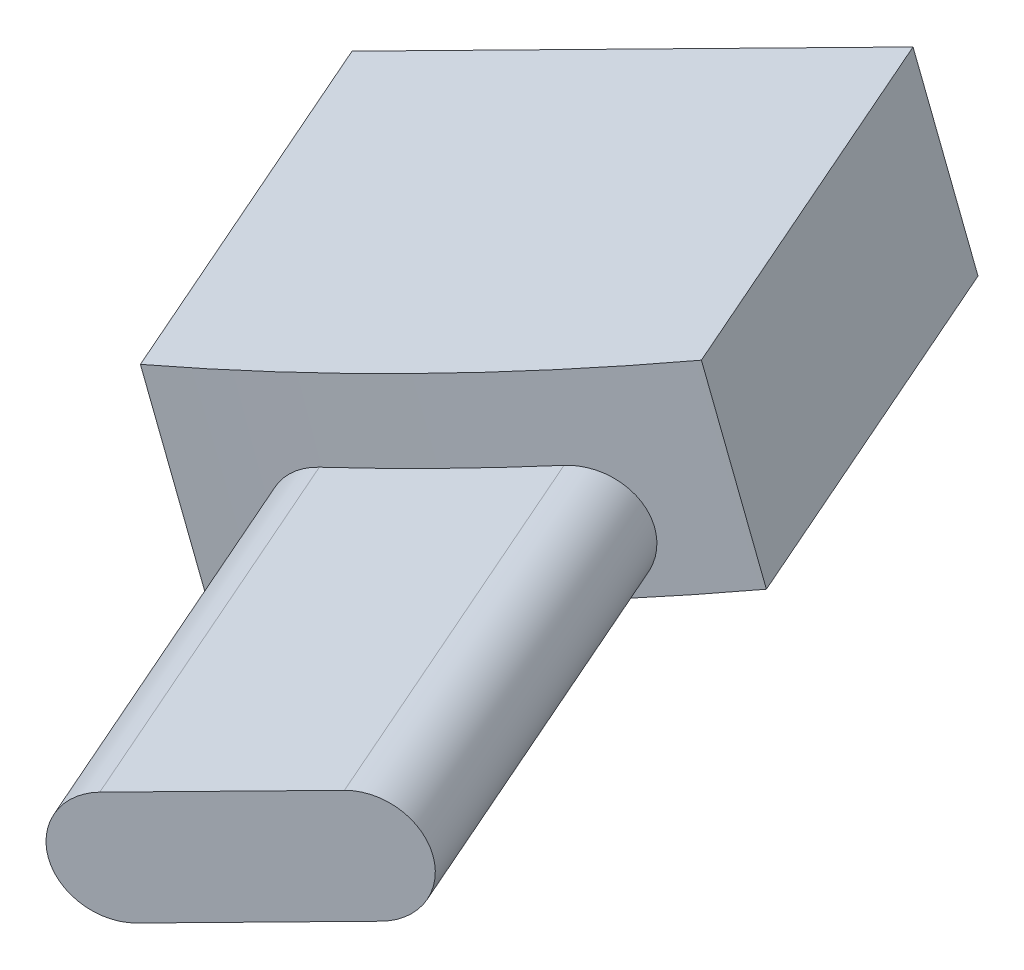
ISO-10303-21;
HEADER;
FILE_DESCRIPTION(('STEP AP214'),'2;1');
FILE_NAME('part.step','',(''),(''),'','','');
FILE_SCHEMA(('AUTOMOTIVE_DESIGN { 1 0 10303 214 1 1 1 1 }'));
ENDSEC;
DATA;
#1=APPLICATION_CONTEXT('core data for automotive mechanical design processes');
#2=APPLICATION_PROTOCOL_DEFINITION('international standard','automotive_design',2000,#1);
#3=PRODUCT_CONTEXT('',#1,'mechanical');
#4=PRODUCT('Part','Part','',(#3));
#5=PRODUCT_RELATED_PRODUCT_CATEGORY('part','',(#4));
#6=PRODUCT_DEFINITION_FORMATION('','',#4);
#7=PRODUCT_DEFINITION_CONTEXT('part definition',#1,'design');
#8=PRODUCT_DEFINITION('design','',#6,#7);
#9=PRODUCT_DEFINITION_SHAPE('','',#8);
#10=(LENGTH_UNIT() NAMED_UNIT(*) SI_UNIT(.MILLI.,.METRE.));
#11=(NAMED_UNIT(*) PLANE_ANGLE_UNIT() SI_UNIT($,.RADIAN.));
#12=(NAMED_UNIT(*) SI_UNIT($,.STERADIAN.) SOLID_ANGLE_UNIT());
#13=UNCERTAINTY_MEASURE_WITH_UNIT(LENGTH_MEASURE(1.E-05),#10,'distance_accuracy_value','');
#14=(GEOMETRIC_REPRESENTATION_CONTEXT(3) GLOBAL_UNCERTAINTY_ASSIGNED_CONTEXT((#13)) GLOBAL_UNIT_ASSIGNED_CONTEXT((#10,
#11,#12)) REPRESENTATION_CONTEXT('',''));
#15=CARTESIAN_POINT('',(0.,0.,0.));
#16=DIRECTION('',(0.,0.,1.));
#17=DIRECTION('',(1.,0.,0.));
#18=AXIS2_PLACEMENT_3D('',#15,#16,#17);
#19=CARTESIAN_POINT('',(9.646987504511,19.1307658125472,88.7231192482595));
#20=DIRECTION('',(0.885067626485375,0.256638244346747,-0.388319595289969));
#21=DIRECTION('',(-0.401776066912331,0.,-0.915737949446488));
#22=AXIS2_PLACEMENT_3D('',#19,#20,#21);
#23=PLANE('',#22);
#24=DIRECTION('',(-0.401776066812214,-4.11737773505413E-10,-0.915737949490414));
#25=VECTOR('',#24,1.);
#26=CARTESIAN_POINT('',(8.00189384591943,25.8963185442456,89.4448969765592));
#27=LINE('',#26,#25);
#28=CARTESIAN_POINT('',(8.00189384591942,25.8963185442456,89.4448969765592));
#29=VERTEX_POINT('',#28);
#30=CARTESIAN_POINT('',(1.97525284373622,25.8963185380696,75.708827734203));
#31=VERTEX_POINT('',#30);
#32=EDGE_CURVE('E187',#29,#31,#27,.T.);
#33=ORIENTED_EDGE('',*,*,#32,.F.);
#34=DIRECTION('',(-0.235013379798795,0.966507533099779,0.103111104042812));
#35=VECTOR('',#34,1.);
#36=CARTESIAN_POINT('',(9.64698750451099,19.1307658125472,88.7231192482595));
#37=LINE('',#36,#35);
#38=CARTESIAN_POINT('',(9.64698750451099,19.1307658125472,88.7231192482595));
#39=VERTEX_POINT('',#38);
#40=EDGE_CURVE('E11',#39,#29,#37,.T.);
#41=ORIENTED_EDGE('',*,*,#40,.F.);
#42=DIRECTION('',(-0.401776066812214,-4.11737773505413E-10,-0.915737949490414));
#43=VECTOR('',#42,1.);
#44=CARTESIAN_POINT('',(9.646987504511,19.1307658125472,88.7231192482595));
#45=LINE('',#44,#43);
#46=CARTESIAN_POINT('',(3.62034650232779,19.1307658063711,74.9870500059033));
#47=VERTEX_POINT('',#46);
#48=EDGE_CURVE('E188',#39,#47,#45,.T.);
#49=ORIENTED_EDGE('',*,*,#48,.T.);
#50=DIRECTION('',(-0.235013379798795,0.966507533099779,0.103111104042812));
#51=VECTOR('',#50,1.);
#52=CARTESIAN_POINT('',(3.62034650232779,19.1307658063711,74.9870500059033));
#53=LINE('',#52,#51);
#54=EDGE_CURVE('E48',#47,#31,#53,.T.);
#55=ORIENTED_EDGE('',*,*,#54,.T.);
#56=EDGE_LOOP('',(#33,#41,#49,#55));
#57=FACE_BOUND('',#56,.T.);
#58=ADVANCED_FACE('F45',(#57),#23,.T.);
#59=CARTESIAN_POINT('',(-21.3456492501435,17.0712438771823,37.3887756136927));
#60=DIRECTION('',(-0.235013379798795,0.966507533099779,0.103111104042812));
#61=DIRECTION('',(-0.971686774379493,-0.236272750218843,0.));
#62=AXIS2_PLACEMENT_3D('',#59,#60,#61);
#63=CYLINDRICAL_SURFACE('',#62,60.);
#64=CARTESIAN_POINT('',(5.79410052273842,18.0661285103681,90.8906838678102));
#65=CARTESIAN_POINT('',(5.84268757366697,18.0806012898717,90.8657686390721));
#66=CARTESIAN_POINT('',(5.89065395389025,18.0973716985718,90.8410394112202));
#67=CARTESIAN_POINT('',(5.98505235872396,18.1353923376617,90.7921090073356));
#68=CARTESIAN_POINT('',(6.0314844669757,18.1566423233784,90.7679078025421));
#69=CARTESIAN_POINT('',(6.16790246919323,18.2268664585587,90.6964023814954));
#70=CARTESIAN_POINT('',(6.25516698683082,18.2823617400123,90.6501158390123));
#71=CARTESIAN_POINT('',(6.41979842936133,18.4091176746111,90.5617402389683));
#72=CARTESIAN_POINT('',(6.49716106200161,18.4803851283662,90.519653003447));
#73=CARTESIAN_POINT('',(6.63985324153835,18.6366660540754,90.4409756925246));
#74=CARTESIAN_POINT('',(6.70518499498658,18.72167699999,90.4043846093161));
#75=CARTESIAN_POINT('',(6.82203777539817,18.9030787182387,90.3378652897426));
#76=CARTESIAN_POINT('',(6.87355456904182,18.9994729657555,90.3079390961756));
#77=CARTESIAN_POINT('',(6.96134791850842,19.2009130587532,90.2557644567414));
#78=CARTESIAN_POINT('',(6.99762237734172,19.3059600922795,90.2335170673736));
#79=CARTESIAN_POINT('',(7.05386417878532,19.5214755598854,90.1975349450172));
#80=CARTESIAN_POINT('',(7.07386670972647,19.6319317448042,90.1837818585512));
#81=CARTESIAN_POINT('',(7.09715382237713,19.8553239238719,90.1652388584531));
#82=CARTESIAN_POINT('',(7.10043982619539,19.9682597062555,90.1604481823926));
#83=CARTESIAN_POINT('',(7.09024045918483,20.1929693260856,90.1600612424553));
#84=CARTESIAN_POINT('',(7.07681689822029,20.3047459127406,90.1644311338004));
#85=CARTESIAN_POINT('',(7.03369370995372,20.5243724952486,90.1822167689265));
#86=CARTESIAN_POINT('',(7.00399399035962,20.6322224688325,90.1956325640013));
#87=CARTESIAN_POINT('',(6.92925130284848,20.8406744103558,90.2310744352031));
#88=CARTESIAN_POINT('',(6.88424413133141,20.941292630701,90.2530804407444));
#89=CARTESIAN_POINT('',(6.78013420207714,21.1327115435295,90.3050152037494));
#90=CARTESIAN_POINT('',(6.72103143232087,21.2235122276415,90.3349439679687));
#91=CARTESIAN_POINT('',(6.5902982455294,21.392843663914,90.4018089209657));
#92=CARTESIAN_POINT('',(6.51865343545494,21.4713601207041,90.4387531647655));
#93=CARTESIAN_POINT('',(6.36486514377206,21.6138020509435,90.5184453772776));
#94=CARTESIAN_POINT('',(6.28272197622514,21.6777279607141,90.5611931723774));
#95=CARTESIAN_POINT('',(6.10989397640011,21.7894121614358,90.6512966059721));
#96=CARTESIAN_POINT('',(6.01918093085953,21.8371144914344,90.6986674825018));
#97=CARTESIAN_POINT('',(5.83191125157094,21.9147340764732,90.7964310829841));
#98=CARTESIAN_POINT('',(5.73535266165879,21.9446453412236,90.8468248184598));
#99=CARTESIAN_POINT('',(5.53874835744317,21.9859049990575,90.9492470158845));
#100=CARTESIAN_POINT('',(5.43869134191799,21.9971861850589,91.0012807092783));
#101=CARTESIAN_POINT('',(5.23827831810434,22.0006284767951,91.105202730974));
#102=CARTESIAN_POINT('',(5.13792300273755,21.9928188489153,91.1570911598504));
#103=CARTESIAN_POINT('',(5.00777352489674,21.97021816382,91.2241457899945));
#104=CARTESIAN_POINT('',(4.97676336694391,21.9638815613833,91.240104390159));
#105=CARTESIAN_POINT('',(4.91512066307455,21.9493828505805,91.2717903980503));
#106=CARTESIAN_POINT('',(4.88448757868008,21.9412237704992,91.2875181436955));
#107=CARTESIAN_POINT('',(4.85404700354325,21.9321586427672,91.3031282839815));
#108=B_SPLINE_CURVE_WITH_KNOTS('',3,(#64,#65,#66,#67,#68,#69,#70,#71,#72,#73,#74,#75,#76,#77,
#78,#79,#80,#81,#82,#83,#84,#85,#86,#87,#88,#89,#90,#91,#92,#93,#94,#95,#96,#97,#98,#99,#100,
#101,#102,#103,#104,#105,#106,#107),.UNSPECIFIED.,.F.,.F.,(4,2,2,2,2,2,2,2,2,2,2,2,2,2,2,2,2,2,
2,2,2,4),(0.,0.169360555841233,0.3387118636572,0.676873839412553,1.01518190815807,
1.35342786678192,1.69177735602055,2.0301733790264,2.3678356546661,2.70546920421302,
3.0418575263784,3.37824775601438,3.71385668663417,4.04946590342247,4.38546281524649,
4.72144967797433,5.05858399686385,5.3958317654377,5.73429350195292,6.07223669913238,
6.17854160043872,6.28467115919691),.UNSPECIFIED.);
#109=CARTESIAN_POINT('',(5.79410052273844,18.0661285103681,90.8906838678102));
#110=VERTEX_POINT('',#109);
#111=CARTESIAN_POINT('',(4.85404700354326,21.9321586427672,91.3031282839815));
#112=VERTEX_POINT('',#111);
#113=EDGE_CURVE('E180',#110,#112,#108,.T.);
#114=ORIENTED_EDGE('',*,*,#113,.F.);
#115=CARTESIAN_POINT('',(-21.3691505881234,17.1678946304923,37.399086724097));
#116=DIRECTION('',(0.235013379798795,-0.966507533099779,-0.103111104042812));
#117=DIRECTION('',(0.971686774379493,0.236272750218843,0.));
#118=AXIS2_PLACEMENT_3D('',#115,#116,#117);
#119=CIRCLE('',#118,60.);
#120=CARTESIAN_POINT('',(-0.401372862659191,16.2696607999408,93.60892103484));
#121=VERTEX_POINT('',#120);
#122=EDGE_CURVE('E115',#121,#110,#119,.F.);
#123=ORIENTED_EDGE('',*,*,#122,.F.);
#124=CARTESIAN_POINT('',(-2.76085840231733,18.202675866081,94.4865393597748));
#125=CARTESIAN_POINT('',(-2.76190252594354,18.0907923356614,94.4841472614002));
#126=CARTESIAN_POINT('',(-2.75400573357073,17.9788106542907,94.4787117887272));
#127=CARTESIAN_POINT('',(-2.72047653683759,17.7578956540001,94.4619425719871));
#128=CARTESIAN_POINT('',(-2.69482354098987,17.6489660272416,94.4506019836707));
#129=CARTESIAN_POINT('',(-2.6265108513131,17.4373877994729,94.4223505001904));
#130=CARTESIAN_POINT('',(-2.58385926345808,17.3347362315714,94.4054422606919));
#131=CARTESIAN_POINT('',(-2.48280199556277,17.1386036166858,94.3664957646029));
#132=CARTESIAN_POINT('',(-2.42439999112829,17.0451204370473,94.3444587050669));
#133=CARTESIAN_POINT('',(-2.29350008513441,16.8698616944996,94.295774559166));
#134=CARTESIAN_POINT('',(-2.22099213776342,16.7880945478782,94.2691241888447));
#135=CARTESIAN_POINT('',(-2.06402088081578,16.6386304234194,94.2118578563309));
#136=CARTESIAN_POINT('',(-1.97955691781585,16.57093421509,94.1812416774056));
#137=CARTESIAN_POINT('',(-1.80082089498667,16.4512921843776,94.1166574888018));
#138=CARTESIAN_POINT('',(-1.7065166241978,16.3994004147528,94.082678491351));
#139=CARTESIAN_POINT('',(-1.51106480319718,16.313119704688,94.0122686080265));
#140=CARTESIAN_POINT('',(-1.4099171319119,16.2787310740056,93.9758376787731));
#141=CARTESIAN_POINT('',(-1.20334882278021,16.2283321807171,93.90129504036));
#142=CARTESIAN_POINT('',(-1.09791550130654,16.212381316502,93.8631783074352));
#143=CARTESIAN_POINT('',(-0.886109556055665,16.1995096378297,93.7863450678496));
#144=CARTESIAN_POINT('',(-0.779736928284882,16.2025889043204,93.7476285586383));
#145=CARTESIAN_POINT('',(-0.569009765841069,16.2277107577471,93.6705954616947));
#146=CARTESIAN_POINT('',(-0.464656883101428,16.2497682479128,93.6322792122188));
#147=CARTESIAN_POINT('',(-0.261034423403334,16.3122567077183,93.5571500032277));
#148=CARTESIAN_POINT('',(-0.161764816689235,16.3526875697933,93.5203370349131));
#149=CARTESIAN_POINT('',(0.0287340592096964,16.4507201754294,93.4493477749715));
#150=CARTESIAN_POINT('',(0.119974373973812,16.5082978368605,93.4151678694788));
#151=CARTESIAN_POINT('',(0.291992900504983,16.6390204217107,93.3504435446495));
#152=CARTESIAN_POINT('',(0.372771219080755,16.7121651861819,93.3198990881981));
#153=CARTESIAN_POINT('',(0.52146292854995,16.8718002291933,93.2634885399857));
#154=CARTESIAN_POINT('',(0.589399501340781,16.95826593839,93.2376140219518));
#155=CARTESIAN_POINT('',(0.710706120822669,17.1421856083473,93.1913544571305));
#156=CARTESIAN_POINT('',(0.764076249153637,17.2396395075187,93.1709693795767));
#157=CARTESIAN_POINT('',(0.854739644848525,17.4426590658657,93.1364377793386));
#158=CARTESIAN_POINT('',(0.892049399941099,17.5482162742539,93.1222848583198));
#159=CARTESIAN_POINT('',(0.949666957504582,17.7645320279446,93.1007304638684));
#160=CARTESIAN_POINT('',(0.969974787846297,17.8752905647203,93.0933289793682));
#161=CARTESIAN_POINT('',(0.993055733295991,18.0988335201136,93.0856056157885));
#162=CARTESIAN_POINT('',(0.99583334384349,18.21161741191,93.0852819216319));
#163=CARTESIAN_POINT('',(0.983819801764042,18.4360367259964,93.0917982191553));
#164=CARTESIAN_POINT('',(0.969028647963698,18.5476721482098,93.0986382113137));
#165=CARTESIAN_POINT('',(0.922311075898766,18.7666271020211,93.1193215108124));
#166=CARTESIAN_POINT('',(0.890384396417851,18.8739465677992,93.1331649249136));
#167=CARTESIAN_POINT('',(0.810295238443852,19.0812214710603,93.1674462066562));
#168=CARTESIAN_POINT('',(0.762132762527814,19.1811769097123,93.1878840732508));
#169=CARTESIAN_POINT('',(0.650912430341361,19.370887271069,93.2347104436026));
#170=CARTESIAN_POINT('',(0.587854476504734,19.4606421269538,93.2610989863371));
#171=CARTESIAN_POINT('',(0.448590990597157,19.6274033494445,93.3189727611082));
#172=CARTESIAN_POINT('',(0.372385466090389,19.704409723385,93.3504579902125));
#173=CARTESIAN_POINT('',(0.208939467111219,19.8434882218467,93.4174962181863));
#174=CARTESIAN_POINT('',(0.121699300360256,19.9055607626855,93.453049103619));
#175=CARTESIAN_POINT('',(-0.0613980158662708,20.0130174398041,93.5270654245129));
#176=CARTESIAN_POINT('',(-0.15725514618553,20.0584016131826,93.5655288535037));
#177=CARTESIAN_POINT('',(-0.354934865108668,20.1312085619627,93.6441340887948));
#178=CARTESIAN_POINT('',(-0.456758287621711,20.158628819991,93.6842761294891));
#179=CARTESIAN_POINT('',(-0.663517234840094,20.1947349431597,93.7649678859047));
#180=CARTESIAN_POINT('',(-0.768452773366008,20.2034207250897,93.8055176034358));
#181=CARTESIAN_POINT('',(-0.978581621274897,20.2018301511866,93.8858146961112));
#182=CARTESIAN_POINT('',(-1.08377506896226,20.191538777661,93.9255614106285));
#183=CARTESIAN_POINT('',(-1.29137914627154,20.1522768071408,94.0030456865413));
#184=CARTESIAN_POINT('',(-1.39378974341148,20.1233059922137,94.0407832244902));
#185=CARTESIAN_POINT('',(-1.59310798102473,20.0474569708057,94.1132463580813));
#186=CARTESIAN_POINT('',(-1.69000594395182,20.0005483246728,94.1479667101094));
#187=CARTESIAN_POINT('',(-1.87535053875667,19.8901673882234,94.2133913247016));
#188=CARTESIAN_POINT('',(-1.9637973879245,19.8266955239273,94.2440956905297));
#189=CARTESIAN_POINT('',(-2.1298415916962,19.6848698653635,94.3007612930686));
#190=CARTESIAN_POINT('',(-2.20742151838925,19.6064926304735,94.3267149307547));
#191=CARTESIAN_POINT('',(-2.34932908131723,19.4371090176516,94.3732144829639));
#192=CARTESIAN_POINT('',(-2.41365341101082,19.3460994981123,94.3937590485755));
#193=CARTESIAN_POINT('',(-2.52714566129737,19.1540128788075,94.4289962347585));
#194=CARTESIAN_POINT('',(-2.57630790987269,19.0529320300992,94.4436866659423));
#195=CARTESIAN_POINT('',(-2.65791418372643,18.8436670477366,94.4669136729914));
#196=CARTESIAN_POINT('',(-2.69037835388391,18.7354916516525,94.4754576690193));
#197=CARTESIAN_POINT('',(-2.72889880245425,18.5559726508475,94.484292310733));
#198=CARTESIAN_POINT('',(-2.74028188664378,18.485814683552,94.4864672099879));
#199=CARTESIAN_POINT('',(-2.75593029519087,18.3446762815857,94.4883499458629));
#200=CARTESIAN_POINT('',(-2.76019562701391,18.2736958477776,94.4880577850707));
#201=CARTESIAN_POINT('',(-2.76085840231733,18.202675866081,94.4865393597748));
#202=B_SPLINE_CURVE_WITH_KNOTS('',3,(#124,#125,#126,#127,#128,#129,#130,#131,#132,#133,#134,
#135,#136,#137,#138,#139,#140,#141,#142,#143,#144,#145,#146,#147,#148,#149,#150,#151,#152,#153,
#154,#155,#156,#157,#158,#159,#160,#161,#162,#163,#164,#165,#166,#167,#168,#169,#170,#171,#172,
#173,#174,#175,#176,#177,#178,#179,#180,#181,#182,#183,#184,#185,#186,#187,#188,#189,#190,#191,
#192,#193,#194,#195,#196,#197,#198,#199,#200,#201),.UNSPECIFIED.,.T.,.F.,(4,2,2,2,2,2,2,2,2,2,2,
2,2,2,2,2,2,2,2,2,2,2,2,2,2,2,2,2,2,2,2,2,2,2,2,2,2,2,4),(0.,0.335482936083787,
0.671355577776141,1.00706824600921,1.3427026381363,1.67857693943215,2.01446960410988,
2.35149847846167,2.68853331709323,3.02665093428015,3.36476998970846,3.70315480603806,
4.04153764135968,4.37944745233521,4.71735381324647,5.05464423572118,5.39193276776025,
5.72887420562411,6.06581509114769,6.40266956823168,6.7395240678138,7.07638370259844,
7.41324328391466,7.75010507174111,8.08696666576175,8.42381886784312,8.76067032108946,
9.09756896892278,9.43446911311105,9.77163597979231,10.1088067802632,10.4465523010974,
10.7842891356794,11.1225615642455,11.4609182712834,11.7994014018505,12.1374752164557,
12.3504289629175,12.5633824860218),.UNSPECIFIED.);
#203=CARTESIAN_POINT('',(-1.34142638185474,20.1356909323411,94.0213654510114));
#204=VERTEX_POINT('',#203);
#205=EDGE_CURVE('E67',#204,#121,#202,.T.);
#206=ORIENTED_EDGE('',*,*,#205,.F.);
#207=CARTESIAN_POINT('',(-22.3092041073185,21.0339247628913,37.8115311402682));
#208=DIRECTION('',(-0.235013379798796,0.966507533099779,0.103111104042812));
#209=DIRECTION('',(-0.971686774379493,-0.236272750218843,0.));
#210=AXIS2_PLACEMENT_3D('',#207,#208,#209);
#211=CIRCLE('',#210,60.);
#212=EDGE_CURVE('E62',#112,#204,#211,.F.);
#213=ORIENTED_EDGE('',*,*,#212,.F.);
#214=EDGE_LOOP('',(#114,#123,#206,#213));
#215=FACE_BOUND('',#214,.T.);
#216=CARTESIAN_POINT('',(-22.990742908735,23.8367966088807,38.1105533419924));
#217=DIRECTION('',(-0.235013379798796,0.966507533099779,0.103111104042812));
#218=DIRECTION('',(-0.971686774379493,-0.236272750218843,0.));
#219=AXIS2_PLACEMENT_3D('',#216,#217,#218);
#220=CIRCLE('',#219,60.);
#221=CARTESIAN_POINT('',(-6.20344155917068,21.7772747224804,95.6774264809631));
#222=VERTEX_POINT('',#221);
#223=EDGE_CURVE('E193',#222,#29,#220,.T.);
#224=ORIENTED_EDGE('',*,*,#223,.F.);
#225=DIRECTION('',(-0.235013379798795,0.966507533099779,0.103111104042812));
#226=VECTOR('',#225,1.);
#227=CARTESIAN_POINT('',(-4.55834790057911,15.011721990782,94.9556487526634));
#228=LINE('',#227,#226);
#229=CARTESIAN_POINT('',(-4.55834790057911,15.011721990782,94.9556487526634));
#230=VERTEX_POINT('',#229);
#231=EDGE_CURVE('E54',#230,#222,#228,.T.);
#232=ORIENTED_EDGE('',*,*,#231,.F.);
#233=CARTESIAN_POINT('',(-21.3456492501435,17.0712438771823,37.3887756136927));
#234=DIRECTION('',(-0.235013379798796,0.966507533099779,0.103111104042812));
#235=DIRECTION('',(-0.971686774379493,-0.236272750218843,0.));
#236=AXIS2_PLACEMENT_3D('',#233,#234,#235);
#237=CIRCLE('',#236,60.);
#238=EDGE_CURVE('E201',#230,#39,#237,.T.);
#239=ORIENTED_EDGE('',*,*,#238,.T.);
#240=ORIENTED_EDGE('',*,*,#40,.T.);
#241=EDGE_LOOP('',(#224,#232,#239,#240));
#242=FACE_BOUND('',#241,.T.);
#243=ADVANCED_FACE('F161',(#215,#242),#63,.T.);
#244=CARTESIAN_POINT('',(-10.5849889027623,15.0117219846059,81.2195795103072));
#245=DIRECTION('',(-0.885067626485375,-0.256638244346747,0.388319595289969));
#246=DIRECTION('',(0.401776066912331,0.,0.915737949446488));
#247=AXIS2_PLACEMENT_3D('',#244,#245,#246);
#248=PLANE('',#247);
#249=DIRECTION('',(0.401776066812214,4.11737773505413E-10,0.915737949490414));
#250=VECTOR('',#249,1.);
#251=CARTESIAN_POINT('',(-12.2300825613539,21.7772747163043,81.9413572386069));
#252=LINE('',#251,#250);
#253=CARTESIAN_POINT('',(-12.2300825613539,21.7772747163043,81.9413572386069));
#254=VERTEX_POINT('',#253);
#255=EDGE_CURVE('E212',#254,#222,#252,.T.);
#256=ORIENTED_EDGE('',*,*,#255,.F.);
#257=DIRECTION('',(-0.235013379798795,0.966507533099779,0.103111104042812));
#258=VECTOR('',#257,1.);
#259=CARTESIAN_POINT('',(-10.5849889027623,15.0117219846059,81.2195795103072));
#260=LINE('',#259,#258);
#261=CARTESIAN_POINT('',(-10.5849889027623,15.0117219846059,81.2195795103072));
#262=VERTEX_POINT('',#261);
#263=EDGE_CURVE('E220',#262,#254,#260,.T.);
#264=ORIENTED_EDGE('',*,*,#263,.F.);
#265=DIRECTION('',(0.401776066812214,4.11737773505413E-10,0.915737949490414));
#266=VECTOR('',#265,1.);
#267=CARTESIAN_POINT('',(-10.5849889027623,15.0117219846059,81.2195795103072));
#268=LINE('',#267,#266);
#269=EDGE_CURVE('E197',#262,#230,#268,.T.);
#270=ORIENTED_EDGE('',*,*,#269,.T.);
#271=ORIENTED_EDGE('',*,*,#231,.T.);
#272=EDGE_LOOP('',(#256,#264,#270,#271));
#273=FACE_BOUND('',#272,.T.);
#274=ADVANCED_FACE('F238',(#273),#248,.T.);
#275=CARTESIAN_POINT('',(3.62034650232779,19.1307658063711,74.9870500059033));
#276=DIRECTION('',(-0.401776066812213,-4.11737468896231E-10,-0.915737949490414));
#277=DIRECTION('',(-0.915737949490414,0.,0.401776066812213));
#278=AXIS2_PLACEMENT_3D('',#275,#276,#277);
#279=PLANE('',#278);
#280=DIRECTION('',(-0.885067626485375,-0.256638244346747,0.388319595289967));
#281=VECTOR('',#280,1.);
#282=CARTESIAN_POINT('',(1.97525284373622,25.8963185380696,75.708827734203));
#283=LINE('',#282,#281);
#284=EDGE_CURVE('E208',#31,#254,#283,.T.);
#285=ORIENTED_EDGE('',*,*,#284,.F.);
#286=ORIENTED_EDGE('',*,*,#54,.F.);
#287=DIRECTION('',(-0.885067626485375,-0.256638244346747,0.388319595289967));
#288=VECTOR('',#287,1.);
#289=CARTESIAN_POINT('',(3.62034650232779,19.1307658063711,74.9870500059033));
#290=LINE('',#289,#288);
#291=EDGE_CURVE('E192',#47,#262,#290,.T.);
#292=ORIENTED_EDGE('',*,*,#291,.T.);
#293=ORIENTED_EDGE('',*,*,#263,.T.);
#294=EDGE_LOOP('',(#285,#286,#292,#293));
#295=FACE_BOUND('',#294,.T.);
#296=ADVANCED_FACE('F230',(#295),#279,.T.);
#297=CARTESIAN_POINT('',(-21.3456492501435,17.0712438771823,37.3887756136927));
#298=DIRECTION('',(-0.235013379798796,0.966507533099779,0.103111104042812));
#299=DIRECTION('',(-0.971686774379493,-0.236272750218843,0.));
#300=AXIS2_PLACEMENT_3D('',#297,#298,#299);
#301=PLANE('',#300);
#302=ORIENTED_EDGE('',*,*,#48,.F.);
#303=ORIENTED_EDGE('',*,*,#238,.F.);
#304=ORIENTED_EDGE('',*,*,#269,.F.);
#305=ORIENTED_EDGE('',*,*,#291,.F.);
#306=EDGE_LOOP('',(#302,#303,#304,#305));
#307=FACE_BOUND('',#306,.T.);
#308=ADVANCED_FACE('F179',(#307),#301,.F.);
#309=CARTESIAN_POINT('',(-22.990742908735,23.8367966088807,38.1105533419924));
#310=DIRECTION('',(-0.235013379798796,0.966507533099779,0.103111104042812));
#311=DIRECTION('',(-0.971686774379493,-0.236272750218843,0.));
#312=AXIS2_PLACEMENT_3D('',#309,#310,#311);
#313=PLANE('',#312);
#314=ORIENTED_EDGE('',*,*,#32,.T.);
#315=ORIENTED_EDGE('',*,*,#284,.T.);
#316=ORIENTED_EDGE('',*,*,#255,.T.);
#317=ORIENTED_EDGE('',*,*,#223,.T.);
#318=EDGE_LOOP('',(#314,#315,#316,#317));
#319=FACE_BOUND('',#318,.T.);
#320=ADVANCED_FACE('F178',(#319),#313,.T.);
#321=CARTESIAN_POINT('',(11.5769454660827,19.9991435829755,105.348605927283));
#322=DIRECTION('',(-0.401776066812213,-4.11737468896231E-10,-0.915737949490414));
#323=DIRECTION('',(-0.915737949490414,0.,0.401776066812213));
#324=AXIS2_PLACEMENT_3D('',#321,#322,#323);
#325=CYLINDRICAL_SURFACE('',#324,1.99999999999999);
#326=DIRECTION('',(-0.401776066812213,-4.11737468896231E-10,-0.915737949490414));
#327=VECTOR('',#326,1.);
#328=CARTESIAN_POINT('',(12.0469722256803,18.066128516776,105.142383719198));
#329=LINE('',#328,#327);
#330=CARTESIAN_POINT('',(12.0469722256803,18.066128516776,105.142383719198));
#331=VERTEX_POINT('',#330);
#332=EDGE_CURVE('E110',#331,#110,#329,.T.);
#333=ORIENTED_EDGE('',*,*,#332,.T.);
#334=ORIENTED_EDGE('',*,*,#113,.T.);
#335=DIRECTION('',(-0.401776066812213,-4.11737468896231E-10,-0.915737949490414));
#336=VECTOR('',#335,1.);
#337=CARTESIAN_POINT('',(11.1069187064851,21.9321586491751,105.554828135369));
#338=LINE('',#337,#336);
#339=CARTESIAN_POINT('',(11.1069187064851,21.9321586491751,105.554828135369));
#340=VERTEX_POINT('',#339);
#341=EDGE_CURVE('E135',#340,#112,#338,.T.);
#342=ORIENTED_EDGE('',*,*,#341,.F.);
#343=CARTESIAN_POINT('',(11.5769454660827,19.9991435829755,105.348605927283));
#344=DIRECTION('',(-0.401776066812213,-4.11737468896231E-10,-0.915737949490414));
#345=DIRECTION('',(-0.915737949490414,0.,0.401776066812213));
#346=AXIS2_PLACEMENT_3D('',#343,#344,#345);
#347=CIRCLE('',#346,1.99999999999999);
#348=EDGE_CURVE('E127',#340,#331,#347,.T.);
#349=ORIENTED_EDGE('',*,*,#348,.T.);
#350=EDGE_LOOP('',(#333,#334,#342,#349));
#351=FACE_BOUND('',#350,.T.);
#352=ADVANCED_FACE('F133',(#351),#325,.T.);
#353=CARTESIAN_POINT('',(11.1069187064851,21.9321586491751,105.554828135369));
#354=DIRECTION('',(-0.235013379798796,0.966507533099779,0.103111104042812));
#355=DIRECTION('',(-0.971686774379493,-0.236272750218843,0.));
#356=AXIS2_PLACEMENT_3D('',#353,#354,#355);
#357=PLANE('',#356);
#358=ORIENTED_EDGE('',*,*,#341,.T.);
#359=ORIENTED_EDGE('',*,*,#212,.T.);
#360=DIRECTION('',(-0.401776066812213,-4.11737468896231E-10,-0.915737949490414));
#361=VECTOR('',#360,1.);
#362=CARTESIAN_POINT('',(4.91144532108749,20.1356909387478,108.273065302399));
#363=LINE('',#362,#361);
#364=CARTESIAN_POINT('',(4.91144532108749,20.1356909387478,108.273065302399));
#365=VERTEX_POINT('',#364);
#366=EDGE_CURVE('E145',#365,#204,#363,.T.);
#367=ORIENTED_EDGE('',*,*,#366,.F.);
#368=DIRECTION('',(0.885067626485375,0.256638244346747,-0.388319595289968));
#369=VECTOR('',#368,1.);
#370=CARTESIAN_POINT('',(11.1069187064851,21.9321586491751,105.554828135369));
#371=LINE('',#370,#369);
#372=EDGE_CURVE('E120',#365,#340,#371,.T.);
#373=ORIENTED_EDGE('',*,*,#372,.T.);
#374=EDGE_LOOP('',(#358,#359,#367,#373));
#375=FACE_BOUND('',#374,.T.);
#376=ADVANCED_FACE('F170',(#375),#357,.T.);
#377=CARTESIAN_POINT('',(5.38147208068508,18.2026758725483,108.066843094313));
#378=DIRECTION('',(-0.401776066812213,-4.11737468896231E-10,-0.915737949490414));
#379=DIRECTION('',(-0.915737949490414,0.,0.401776066812213));
#380=AXIS2_PLACEMENT_3D('',#377,#378,#379);
#381=CYLINDRICAL_SURFACE('',#380,1.99999999999999);
#382=ORIENTED_EDGE('',*,*,#366,.T.);
#383=ORIENTED_EDGE('',*,*,#205,.T.);
#384=DIRECTION('',(-0.401776066812213,-4.11737468896231E-10,-0.915737949490414));
#385=VECTOR('',#384,1.);
#386=CARTESIAN_POINT('',(5.85149884028267,16.2696608063487,107.860620886227));
#387=LINE('',#386,#385);
#388=CARTESIAN_POINT('',(5.85149884028267,16.2696608063487,107.860620886227));
#389=VERTEX_POINT('',#388);
#390=EDGE_CURVE('E119',#389,#121,#387,.T.);
#391=ORIENTED_EDGE('',*,*,#390,.F.);
#392=CARTESIAN_POINT('',(5.38147208068508,18.2026758725483,108.066843094313));
#393=DIRECTION('',(-0.401776066812213,-4.11737468896231E-10,-0.915737949490414));
#394=DIRECTION('',(-0.915737949490414,0.,0.401776066812213));
#395=AXIS2_PLACEMENT_3D('',#392,#393,#394);
#396=CIRCLE('',#395,1.99999999999999);
#397=EDGE_CURVE('E130',#389,#365,#396,.T.);
#398=ORIENTED_EDGE('',*,*,#397,.T.);
#399=EDGE_LOOP('',(#382,#383,#391,#398));
#400=FACE_BOUND('',#399,.T.);
#401=ADVANCED_FACE('F165',(#400),#381,.T.);
#402=CARTESIAN_POINT('',(12.0469722256803,18.066128516776,105.142383719198));
#403=DIRECTION('',(0.235013379798795,-0.966507533099779,-0.103111104042812));
#404=DIRECTION('',(0.971686774379493,0.236272750218843,0.));
#405=AXIS2_PLACEMENT_3D('',#402,#403,#404);
#406=PLANE('',#405);
#407=ORIENTED_EDGE('',*,*,#390,.T.);
#408=ORIENTED_EDGE('',*,*,#122,.T.);
#409=ORIENTED_EDGE('',*,*,#332,.F.);
#410=DIRECTION('',(-0.885067626485375,-0.256638244346747,0.388319595289968));
#411=VECTOR('',#410,1.);
#412=CARTESIAN_POINT('',(12.0469722256803,18.066128516776,105.142383719198));
#413=LINE('',#412,#411);
#414=EDGE_CURVE('E114',#331,#389,#413,.T.);
#415=ORIENTED_EDGE('',*,*,#414,.T.);
#416=EDGE_LOOP('',(#407,#408,#409,#415));
#417=FACE_BOUND('',#416,.T.);
#418=ADVANCED_FACE('F113',(#417),#406,.T.);
#419=CARTESIAN_POINT('',(11.5769454660827,19.9991435829755,105.348605927283));
#420=DIRECTION('',(-0.401776066812213,-4.11737468896231E-10,-0.915737949490414));
#421=DIRECTION('',(-0.915737949490414,0.,0.401776066812213));
#422=AXIS2_PLACEMENT_3D('',#419,#420,#421);
#423=PLANE('',#422);
#424=ORIENTED_EDGE('',*,*,#348,.F.);
#425=ORIENTED_EDGE('',*,*,#372,.F.);
#426=ORIENTED_EDGE('',*,*,#397,.F.);
#427=ORIENTED_EDGE('',*,*,#414,.F.);
#428=EDGE_LOOP('',(#424,#425,#426,#427));
#429=FACE_BOUND('',#428,.T.);
#430=ADVANCED_FACE('F125',(#429),#423,.F.);
#431=CLOSED_SHELL('',(#58,#243,#274,#296,#308,#320,#352,#376,#401,#418,#430));
#432=MANIFOLD_SOLID_BREP('B2',#431);
#433=ADVANCED_BREP_SHAPE_REPRESENTATION('',(#18,#432),#14);
#434=SHAPE_DEFINITION_REPRESENTATION(#9,#433);
ENDSEC;
END-ISO-10303-21;
